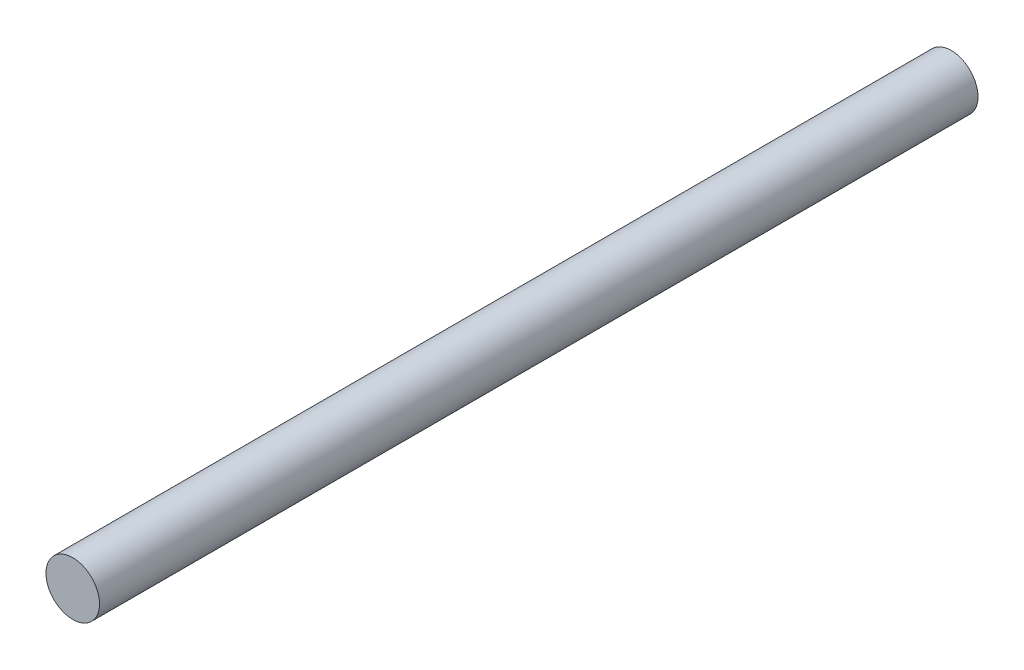
ISO-10303-21;
HEADER;
FILE_DESCRIPTION(('STEP AP214'),'2;1');
FILE_NAME('part.step','',(''),(''),'','','');
FILE_SCHEMA(('AUTOMOTIVE_DESIGN { 1 0 10303 214 1 1 1 1 }'));
ENDSEC;
DATA;
#1=APPLICATION_CONTEXT('core data for automotive mechanical design processes');
#2=APPLICATION_PROTOCOL_DEFINITION('international standard','automotive_design',2000,#1);
#3=PRODUCT_CONTEXT('',#1,'mechanical');
#4=PRODUCT('Part','Part','',(#3));
#5=PRODUCT_RELATED_PRODUCT_CATEGORY('part','',(#4));
#6=PRODUCT_DEFINITION_FORMATION('','',#4);
#7=PRODUCT_DEFINITION_CONTEXT('part definition',#1,'design');
#8=PRODUCT_DEFINITION('design','',#6,#7);
#9=PRODUCT_DEFINITION_SHAPE('','',#8);
#10=(LENGTH_UNIT() NAMED_UNIT(*) SI_UNIT(.MILLI.,.METRE.));
#11=(NAMED_UNIT(*) PLANE_ANGLE_UNIT() SI_UNIT($,.RADIAN.));
#12=(NAMED_UNIT(*) SI_UNIT($,.STERADIAN.) SOLID_ANGLE_UNIT());
#13=UNCERTAINTY_MEASURE_WITH_UNIT(LENGTH_MEASURE(1.E-05),#10,'distance_accuracy_value','');
#14=(GEOMETRIC_REPRESENTATION_CONTEXT(3) GLOBAL_UNCERTAINTY_ASSIGNED_CONTEXT((#13)) GLOBAL_UNIT_ASSIGNED_CONTEXT((#10,
#11,#12)) REPRESENTATION_CONTEXT('',''));
#15=CARTESIAN_POINT('',(0.,0.,0.));
#16=DIRECTION('',(0.,0.,1.));
#17=DIRECTION('',(1.,0.,0.));
#18=AXIS2_PLACEMENT_3D('',#15,#16,#17);
#19=CARTESIAN_POINT('',(0.,0.,41.));
#20=DIRECTION('',(0.,0.,-1.));
#21=DIRECTION('',(-1.,0.,0.));
#22=AXIS2_PLACEMENT_3D('',#19,#20,#21);
#23=CYLINDRICAL_SURFACE('',#22,2.5);
#24=CARTESIAN_POINT('',(0.,0.,41.));
#25=DIRECTION('',(0.,0.,1.));
#26=DIRECTION('',(1.,0.,0.));
#27=AXIS2_PLACEMENT_3D('',#24,#25,#26);
#28=CIRCLE('',#27,2.5);
#29=CARTESIAN_POINT('',(2.5,0.,41.));
#30=VERTEX_POINT('',#29);
#31=EDGE_CURVE('E10',#30,#30,#28,.T.);
#32=ORIENTED_EDGE('',*,*,#31,.F.);
#33=EDGE_LOOP('',(#32));
#34=FACE_BOUND('',#33,.T.);
#35=CARTESIAN_POINT('',(0.,0.,-41.));
#36=DIRECTION('',(0.,0.,1.));
#37=DIRECTION('',(1.,0.,0.));
#38=AXIS2_PLACEMENT_3D('',#35,#36,#37);
#39=CIRCLE('',#38,2.5);
#40=CARTESIAN_POINT('',(2.5,0.,-41.));
#41=VERTEX_POINT('',#40);
#42=EDGE_CURVE('E39',#41,#41,#39,.T.);
#43=ORIENTED_EDGE('',*,*,#42,.T.);
#44=EDGE_LOOP('',(#43));
#45=FACE_BOUND('',#44,.T.);
#46=ADVANCED_FACE('F36',(#34,#45),#23,.T.);
#47=CARTESIAN_POINT('',(0.,0.,41.));
#48=DIRECTION('',(0.,0.,1.));
#49=DIRECTION('',(1.,0.,0.));
#50=AXIS2_PLACEMENT_3D('',#47,#48,#49);
#51=PLANE('',#50);
#52=ORIENTED_EDGE('',*,*,#31,.T.);
#53=EDGE_LOOP('',(#52));
#54=FACE_BOUND('',#53,.T.);
#55=ADVANCED_FACE('F51',(#54),#51,.T.);
#56=CARTESIAN_POINT('',(0.,0.,-41.));
#57=DIRECTION('',(0.,0.,1.));
#58=DIRECTION('',(1.,0.,0.));
#59=AXIS2_PLACEMENT_3D('',#56,#57,#58);
#60=PLANE('',#59);
#61=ORIENTED_EDGE('',*,*,#42,.F.);
#62=EDGE_LOOP('',(#61));
#63=FACE_BOUND('',#62,.T.);
#64=ADVANCED_FACE('F49',(#63),#60,.F.);
#65=CLOSED_SHELL('',(#46,#55,#64));
#66=MANIFOLD_SOLID_BREP('B2',#65);
#67=ADVANCED_BREP_SHAPE_REPRESENTATION('',(#18,#66),#14);
#68=SHAPE_DEFINITION_REPRESENTATION(#9,#67);
ENDSEC;
END-ISO-10303-21;
